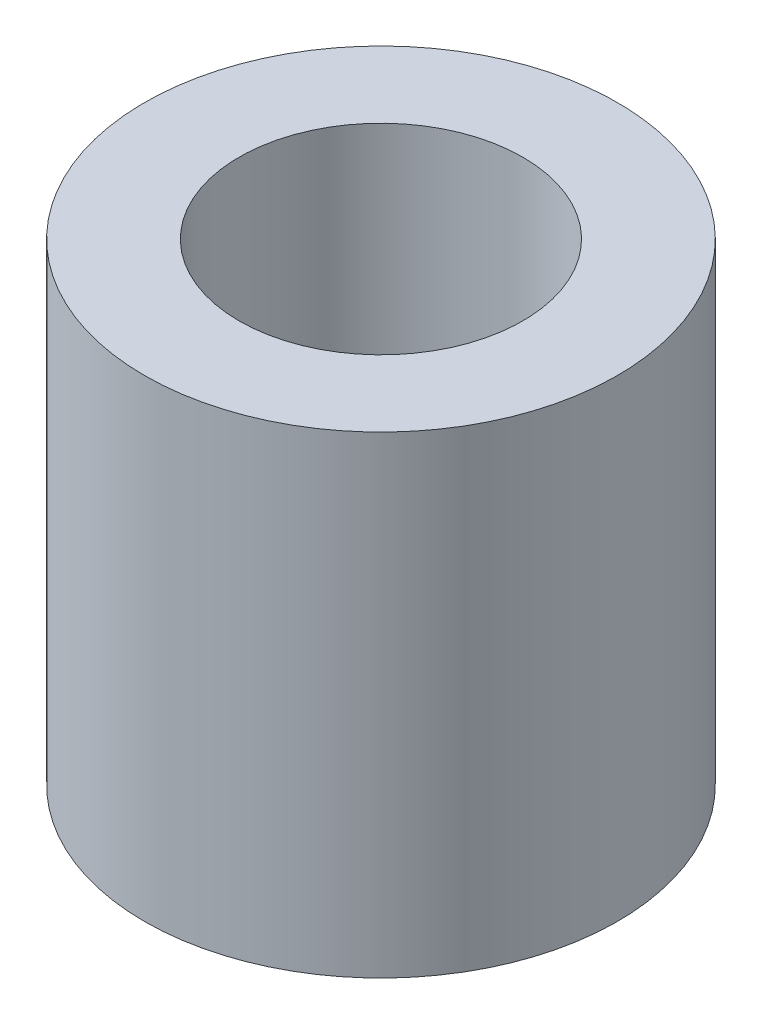
ISO-10303-21;
HEADER;
FILE_DESCRIPTION(('STEP AP214'),'2;1');
FILE_NAME('part.step','',(''),(''),'','','');
FILE_SCHEMA(('AUTOMOTIVE_DESIGN { 1 0 10303 214 1 1 1 1 }'));
ENDSEC;
DATA;
#1=APPLICATION_CONTEXT('core data for automotive mechanical design processes');
#2=APPLICATION_PROTOCOL_DEFINITION('international standard','automotive_design',2000,#1);
#3=PRODUCT_CONTEXT('',#1,'mechanical');
#4=PRODUCT('Part','Part','',(#3));
#5=PRODUCT_RELATED_PRODUCT_CATEGORY('part','',(#4));
#6=PRODUCT_DEFINITION_FORMATION('','',#4);
#7=PRODUCT_DEFINITION_CONTEXT('part definition',#1,'design');
#8=PRODUCT_DEFINITION('design','',#6,#7);
#9=PRODUCT_DEFINITION_SHAPE('','',#8);
#10=(LENGTH_UNIT() NAMED_UNIT(*) SI_UNIT(.MILLI.,.METRE.));
#11=(NAMED_UNIT(*) PLANE_ANGLE_UNIT() SI_UNIT($,.RADIAN.));
#12=(NAMED_UNIT(*) SI_UNIT($,.STERADIAN.) SOLID_ANGLE_UNIT());
#13=UNCERTAINTY_MEASURE_WITH_UNIT(LENGTH_MEASURE(1.E-05),#10,'distance_accuracy_value','');
#14=(GEOMETRIC_REPRESENTATION_CONTEXT(3) GLOBAL_UNCERTAINTY_ASSIGNED_CONTEXT((#13)) GLOBAL_UNIT_ASSIGNED_CONTEXT((#10,
#11,#12)) REPRESENTATION_CONTEXT('',''));
#15=CARTESIAN_POINT('',(0.,0.,0.));
#16=DIRECTION('',(0.,0.,1.));
#17=DIRECTION('',(1.,0.,0.));
#18=AXIS2_PLACEMENT_3D('',#15,#16,#17);
#19=CARTESIAN_POINT('',(0.,5.,0.));
#20=DIRECTION('',(0.,1.,0.));
#21=DIRECTION('',(0.,0.,1.));
#22=AXIS2_PLACEMENT_3D('',#19,#20,#21);
#23=PLANE('',#22);
#24=CARTESIAN_POINT('',(0.,5.,0.));
#25=DIRECTION('',(0.,1.,0.));
#26=DIRECTION('',(0.,0.,1.));
#27=AXIS2_PLACEMENT_3D('',#24,#25,#26);
#28=CIRCLE('',#27,2.49999999999995);
#29=CARTESIAN_POINT('',(0.,5.,2.49999999999995));
#30=VERTEX_POINT('',#29);
#31=EDGE_CURVE('E10',#30,#30,#28,.T.);
#32=ORIENTED_EDGE('',*,*,#31,.T.);
#33=EDGE_LOOP('',(#32));
#34=FACE_BOUND('',#33,.T.);
#35=CARTESIAN_POINT('',(0.,5.,0.));
#36=DIRECTION('',(0.,1.,0.));
#37=DIRECTION('',(0.,0.,1.));
#38=AXIS2_PLACEMENT_3D('',#35,#36,#37);
#39=CIRCLE('',#38,1.50000000000006);
#40=CARTESIAN_POINT('',(0.,5.,1.50000000000006));
#41=VERTEX_POINT('',#40);
#42=EDGE_CURVE('E46',#41,#41,#39,.T.);
#43=ORIENTED_EDGE('',*,*,#42,.F.);
#44=EDGE_LOOP('',(#43));
#45=FACE_BOUND('',#44,.T.);
#46=ADVANCED_FACE('F35',(#34,#45),#23,.T.);
#47=CARTESIAN_POINT('',(0.,0.,0.));
#48=DIRECTION('',(0.,1.,0.));
#49=DIRECTION('',(0.,0.,1.));
#50=AXIS2_PLACEMENT_3D('',#47,#48,#49);
#51=PLANE('',#50);
#52=CARTESIAN_POINT('',(0.,0.,0.));
#53=DIRECTION('',(0.,1.,0.));
#54=DIRECTION('',(0.,0.,1.));
#55=AXIS2_PLACEMENT_3D('',#52,#53,#54);
#56=CIRCLE('',#55,2.49999999999995);
#57=CARTESIAN_POINT('',(0.,0.,2.49999999999995));
#58=VERTEX_POINT('',#57);
#59=EDGE_CURVE('E39',#58,#58,#56,.T.);
#60=ORIENTED_EDGE('',*,*,#59,.F.);
#61=EDGE_LOOP('',(#60));
#62=FACE_BOUND('',#61,.T.);
#63=CARTESIAN_POINT('',(0.,0.,0.));
#64=DIRECTION('',(0.,1.,0.));
#65=DIRECTION('',(0.,0.,1.));
#66=AXIS2_PLACEMENT_3D('',#63,#64,#65);
#67=CIRCLE('',#66,1.50000000000006);
#68=CARTESIAN_POINT('',(0.,0.,1.50000000000006));
#69=VERTEX_POINT('',#68);
#70=EDGE_CURVE('E48',#69,#69,#67,.T.);
#71=ORIENTED_EDGE('',*,*,#70,.T.);
#72=EDGE_LOOP('',(#71));
#73=FACE_BOUND('',#72,.T.);
#74=ADVANCED_FACE('F58',(#62,#73),#51,.F.);
#75=CARTESIAN_POINT('',(0.,5.,0.));
#76=DIRECTION('',(0.,-1.,0.));
#77=DIRECTION('',(0.,0.,-1.));
#78=AXIS2_PLACEMENT_3D('',#75,#76,#77);
#79=CYLINDRICAL_SURFACE('',#78,2.49999999999995);
#80=ORIENTED_EDGE('',*,*,#31,.F.);
#81=EDGE_LOOP('',(#80));
#82=FACE_BOUND('',#81,.T.);
#83=ORIENTED_EDGE('',*,*,#59,.T.);
#84=EDGE_LOOP('',(#83));
#85=FACE_BOUND('',#84,.T.);
#86=ADVANCED_FACE('F37',(#82,#85),#79,.T.);
#87=CARTESIAN_POINT('',(0.,5.,0.));
#88=DIRECTION('',(0.,-1.,0.));
#89=DIRECTION('',(0.,0.,-1.));
#90=AXIS2_PLACEMENT_3D('',#87,#88,#89);
#91=CYLINDRICAL_SURFACE('',#90,1.50000000000006);
#92=ORIENTED_EDGE('',*,*,#42,.T.);
#93=EDGE_LOOP('',(#92));
#94=FACE_BOUND('',#93,.T.);
#95=ORIENTED_EDGE('',*,*,#70,.F.);
#96=EDGE_LOOP('',(#95));
#97=FACE_BOUND('',#96,.T.);
#98=ADVANCED_FACE('F54',(#94,#97),#91,.F.);
#99=CLOSED_SHELL('',(#46,#74,#86,#98));
#100=MANIFOLD_SOLID_BREP('B2',#99);
#101=ADVANCED_BREP_SHAPE_REPRESENTATION('',(#18,#100),#14);
#102=SHAPE_DEFINITION_REPRESENTATION(#9,#101);
ENDSEC;
END-ISO-10303-21;
